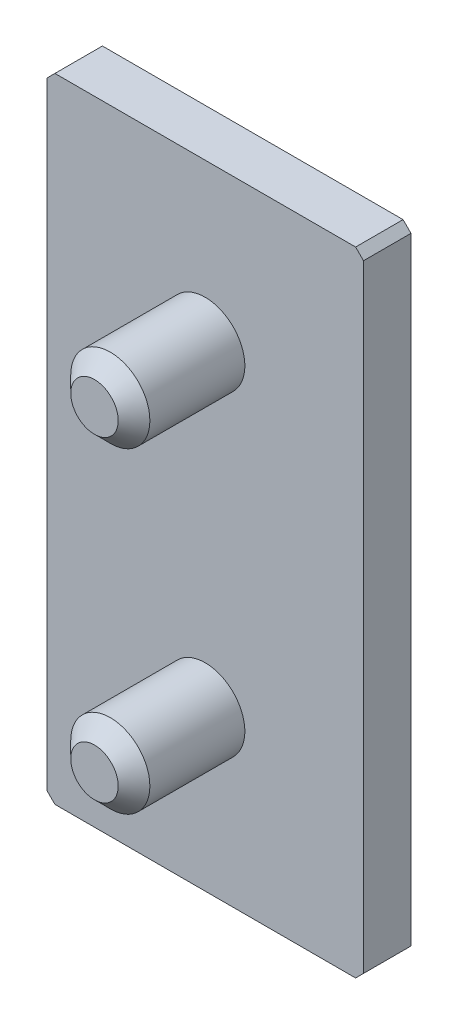
ISO-10303-21;
HEADER;
FILE_DESCRIPTION(('STEP AP214'),'2;1');
FILE_NAME('part.step','',(''),(''),'','','');
FILE_SCHEMA(('AUTOMOTIVE_DESIGN { 1 0 10303 214 1 1 1 1 }'));
ENDSEC;
DATA;
#1=APPLICATION_CONTEXT('core data for automotive mechanical design processes');
#2=APPLICATION_PROTOCOL_DEFINITION('international standard','automotive_design',2000,#1);
#3=PRODUCT_CONTEXT('',#1,'mechanical');
#4=PRODUCT('Part','Part','',(#3));
#5=PRODUCT_RELATED_PRODUCT_CATEGORY('part','',(#4));
#6=PRODUCT_DEFINITION_FORMATION('','',#4);
#7=PRODUCT_DEFINITION_CONTEXT('part definition',#1,'design');
#8=PRODUCT_DEFINITION('design','',#6,#7);
#9=PRODUCT_DEFINITION_SHAPE('','',#8);
#10=(LENGTH_UNIT() NAMED_UNIT(*) SI_UNIT(.MILLI.,.METRE.));
#11=(NAMED_UNIT(*) PLANE_ANGLE_UNIT() SI_UNIT($,.RADIAN.));
#12=(NAMED_UNIT(*) SI_UNIT($,.STERADIAN.) SOLID_ANGLE_UNIT());
#13=UNCERTAINTY_MEASURE_WITH_UNIT(LENGTH_MEASURE(1.E-05),#10,'distance_accuracy_value','');
#14=(GEOMETRIC_REPRESENTATION_CONTEXT(3) GLOBAL_UNCERTAINTY_ASSIGNED_CONTEXT((#13)) GLOBAL_UNIT_ASSIGNED_CONTEXT((#10,
#11,#12)) REPRESENTATION_CONTEXT('',''));
#15=CARTESIAN_POINT('',(0.,0.,0.));
#16=DIRECTION('',(0.,0.,1.));
#17=DIRECTION('',(1.,0.,0.));
#18=AXIS2_PLACEMENT_3D('',#15,#16,#17);
#19=CARTESIAN_POINT('',(0.,0.,3.));
#20=DIRECTION('',(1.,0.,0.));
#21=DIRECTION('',(0.,0.,-1.));
#22=AXIS2_PLACEMENT_3D('',#19,#20,#21);
#23=PLANE('',#22);
#24=DIRECTION('',(0.,-1.,0.));
#25=VECTOR('',#24,1.);
#26=CARTESIAN_POINT('',(0.,0.,0.));
#27=LINE('',#26,#25);
#28=CARTESIAN_POINT('',(0.,39.5,0.));
#29=VERTEX_POINT('',#28);
#30=CARTESIAN_POINT('',(0.,0.5,0.));
#31=VERTEX_POINT('',#30);
#32=EDGE_CURVE('E124',#29,#31,#27,.T.);
#33=ORIENTED_EDGE('',*,*,#32,.T.);
#34=DIRECTION('',(0.,0.,1.));
#35=VECTOR('',#34,1.);
#36=CARTESIAN_POINT('',(0.,0.5,3.));
#37=LINE('',#36,#35);
#38=CARTESIAN_POINT('',(0.,0.5,3.));
#39=VERTEX_POINT('',#38);
#40=EDGE_CURVE('E102',#31,#39,#37,.T.);
#41=ORIENTED_EDGE('',*,*,#40,.T.);
#42=DIRECTION('',(0.,-1.,0.));
#43=VECTOR('',#42,1.);
#44=CARTESIAN_POINT('',(0.,0.,3.));
#45=LINE('',#44,#43);
#46=CARTESIAN_POINT('',(0.,39.5,3.));
#47=VERTEX_POINT('',#46);
#48=EDGE_CURVE('E133',#47,#39,#45,.T.);
#49=ORIENTED_EDGE('',*,*,#48,.F.);
#50=DIRECTION('',(0.,0.,-1.));
#51=VECTOR('',#50,1.);
#52=CARTESIAN_POINT('',(0.,39.5,3.));
#53=LINE('',#52,#51);
#54=EDGE_CURVE('E107',#47,#29,#53,.T.);
#55=ORIENTED_EDGE('',*,*,#54,.T.);
#56=EDGE_LOOP('',(#33,#41,#49,#55));
#57=FACE_BOUND('',#56,.T.);
#58=ADVANCED_FACE('F32',(#57),#23,.F.);
#59=CARTESIAN_POINT('',(0.,0.,3.));
#60=DIRECTION('',(0.,1.,0.));
#61=DIRECTION('',(0.,0.,1.));
#62=AXIS2_PLACEMENT_3D('',#59,#60,#61);
#63=PLANE('',#62);
#64=DIRECTION('',(1.,0.,0.));
#65=VECTOR('',#64,1.);
#66=CARTESIAN_POINT('',(0.,0.,3.));
#67=LINE('',#66,#65);
#68=CARTESIAN_POINT('',(0.5,0.,3.));
#69=VERTEX_POINT('',#68);
#70=CARTESIAN_POINT('',(19.5,1.11022302462516E-13,3.));
#71=VERTEX_POINT('',#70);
#72=EDGE_CURVE('E117',#69,#71,#67,.T.);
#73=ORIENTED_EDGE('',*,*,#72,.F.);
#74=DIRECTION('',(0.,0.,-1.));
#75=VECTOR('',#74,1.);
#76=CARTESIAN_POINT('',(0.5,0.,3.));
#77=LINE('',#76,#75);
#78=CARTESIAN_POINT('',(0.5,0.,0.));
#79=VERTEX_POINT('',#78);
#80=EDGE_CURVE('E101',#69,#79,#77,.T.);
#81=ORIENTED_EDGE('',*,*,#80,.T.);
#82=DIRECTION('',(1.,0.,0.));
#83=VECTOR('',#82,1.);
#84=CARTESIAN_POINT('',(0.,0.,0.));
#85=LINE('',#84,#83);
#86=CARTESIAN_POINT('',(19.5,1.11022302462516E-13,0.));
#87=VERTEX_POINT('',#86);
#88=EDGE_CURVE('E114',#79,#87,#85,.T.);
#89=ORIENTED_EDGE('',*,*,#88,.T.);
#90=DIRECTION('',(0.,0.,1.));
#91=VECTOR('',#90,1.);
#92=CARTESIAN_POINT('',(19.5,1.11022302462516E-13,3.));
#93=LINE('',#92,#91);
#94=EDGE_CURVE('E119',#87,#71,#93,.T.);
#95=ORIENTED_EDGE('',*,*,#94,.T.);
#96=EDGE_LOOP('',(#73,#81,#89,#95));
#97=FACE_BOUND('',#96,.T.);
#98=ADVANCED_FACE('F113',(#97),#63,.F.);
#99=CARTESIAN_POINT('',(20.,1.11022302462516E-13,3.));
#100=DIRECTION('',(-1.,0.,0.));
#101=DIRECTION('',(0.,0.,1.));
#102=AXIS2_PLACEMENT_3D('',#99,#100,#101);
#103=PLANE('',#102);
#104=DIRECTION('',(0.,1.,0.));
#105=VECTOR('',#104,1.);
#106=CARTESIAN_POINT('',(20.,1.11022302462516E-13,3.));
#107=LINE('',#106,#105);
#108=CARTESIAN_POINT('',(20.,0.500000000000111,3.));
#109=VERTEX_POINT('',#108);
#110=CARTESIAN_POINT('',(20.,39.5000000000001,3.));
#111=VERTEX_POINT('',#110);
#112=EDGE_CURVE('E185',#109,#111,#107,.T.);
#113=ORIENTED_EDGE('',*,*,#112,.F.);
#114=DIRECTION('',(0.,0.,-1.));
#115=VECTOR('',#114,1.);
#116=CARTESIAN_POINT('',(20.,0.500000000000111,3.));
#117=LINE('',#116,#115);
#118=CARTESIAN_POINT('',(20.,0.500000000000111,0.));
#119=VERTEX_POINT('',#118);
#120=EDGE_CURVE('E170',#109,#119,#117,.T.);
#121=ORIENTED_EDGE('',*,*,#120,.T.);
#122=DIRECTION('',(0.,1.,0.));
#123=VECTOR('',#122,1.);
#124=CARTESIAN_POINT('',(20.,1.11022302462516E-13,0.));
#125=LINE('',#124,#123);
#126=CARTESIAN_POINT('',(20.,39.5000000000001,0.));
#127=VERTEX_POINT('',#126);
#128=EDGE_CURVE('E123',#119,#127,#125,.T.);
#129=ORIENTED_EDGE('',*,*,#128,.T.);
#130=DIRECTION('',(0.,0.,1.));
#131=VECTOR('',#130,1.);
#132=CARTESIAN_POINT('',(20.,39.5000000000001,3.));
#133=LINE('',#132,#131);
#134=EDGE_CURVE('E168',#127,#111,#133,.T.);
#135=ORIENTED_EDGE('',*,*,#134,.T.);
#136=EDGE_LOOP('',(#113,#121,#129,#135));
#137=FACE_BOUND('',#136,.T.);
#138=ADVANCED_FACE('F198',(#137),#103,.F.);
#139=CARTESIAN_POINT('',(0.,40.,3.));
#140=DIRECTION('',(0.,-1.,0.));
#141=DIRECTION('',(0.,0.,-1.));
#142=AXIS2_PLACEMENT_3D('',#139,#140,#141);
#143=PLANE('',#142);
#144=DIRECTION('',(-1.,0.,0.));
#145=VECTOR('',#144,1.);
#146=CARTESIAN_POINT('',(0.,40.,0.));
#147=LINE('',#146,#145);
#148=CARTESIAN_POINT('',(19.5,40.0000000000001,0.));
#149=VERTEX_POINT('',#148);
#150=CARTESIAN_POINT('',(0.500000000000028,40.,0.));
#151=VERTEX_POINT('',#150);
#152=EDGE_CURVE('E127',#149,#151,#147,.T.);
#153=ORIENTED_EDGE('',*,*,#152,.T.);
#154=DIRECTION('',(0.,0.,1.));
#155=VECTOR('',#154,1.);
#156=CARTESIAN_POINT('',(0.500000000000028,40.,3.));
#157=LINE('',#156,#155);
#158=CARTESIAN_POINT('',(0.500000000000028,40.,3.));
#159=VERTEX_POINT('',#158);
#160=EDGE_CURVE('E11',#151,#159,#157,.T.);
#161=ORIENTED_EDGE('',*,*,#160,.T.);
#162=DIRECTION('',(-1.,0.,0.));
#163=VECTOR('',#162,1.);
#164=CARTESIAN_POINT('',(0.,40.,3.));
#165=LINE('',#164,#163);
#166=CARTESIAN_POINT('',(19.5,40.0000000000001,3.));
#167=VERTEX_POINT('',#166);
#168=EDGE_CURVE('E138',#167,#159,#165,.T.);
#169=ORIENTED_EDGE('',*,*,#168,.F.);
#170=DIRECTION('',(0.,0.,-1.));
#171=VECTOR('',#170,1.);
#172=CARTESIAN_POINT('',(19.5,40.0000000000001,3.));
#173=LINE('',#172,#171);
#174=EDGE_CURVE('E40',#167,#149,#173,.T.);
#175=ORIENTED_EDGE('',*,*,#174,.T.);
#176=EDGE_LOOP('',(#153,#161,#169,#175));
#177=FACE_BOUND('',#176,.T.);
#178=ADVANCED_FACE('F175',(#177),#143,.F.);
#179=CARTESIAN_POINT('',(0.,0.,3.));
#180=DIRECTION('',(0.,0.,-1.));
#181=DIRECTION('',(-1.,0.,0.));
#182=AXIS2_PLACEMENT_3D('',#179,#180,#181);
#183=PLANE('',#182);
#184=CARTESIAN_POINT('',(10.,10.0000000000001,3.));
#185=DIRECTION('',(0.,0.,-1.));
#186=DIRECTION('',(-1.,0.,0.));
#187=AXIS2_PLACEMENT_3D('',#184,#185,#186);
#188=CIRCLE('',#187,2.5);
#189=CARTESIAN_POINT('',(7.50000000000001,10.0000000000001,3.));
#190=VERTEX_POINT('',#189);
#191=EDGE_CURVE('E137',#190,#190,#188,.F.);
#192=ORIENTED_EDGE('',*,*,#191,.F.);
#193=EDGE_LOOP('',(#192));
#194=FACE_BOUND('',#193,.T.);
#195=CARTESIAN_POINT('',(10.,30.0000000000001,3.));
#196=DIRECTION('',(0.,0.,-1.));
#197=DIRECTION('',(-1.,0.,0.));
#198=AXIS2_PLACEMENT_3D('',#195,#196,#197);
#199=CIRCLE('',#198,2.5);
#200=CARTESIAN_POINT('',(7.50000000000003,30.0000000000001,3.));
#201=VERTEX_POINT('',#200);
#202=EDGE_CURVE('E134',#201,#201,#199,.F.);
#203=ORIENTED_EDGE('',*,*,#202,.F.);
#204=EDGE_LOOP('',(#203));
#205=FACE_BOUND('',#204,.T.);
#206=ORIENTED_EDGE('',*,*,#48,.T.);
#207=DIRECTION('',(-0.707106781186543,0.707106781186553,0.));
#208=VECTOR('',#207,1.);
#209=CARTESIAN_POINT('',(0.5,0.,3.));
#210=LINE('',#209,#208);
#211=EDGE_CURVE('E166',#39,#69,#210,.F.);
#212=ORIENTED_EDGE('',*,*,#211,.T.);
#213=ORIENTED_EDGE('',*,*,#72,.T.);
#214=DIRECTION('',(-0.707106781186553,-0.707106781186543,0.));
#215=VECTOR('',#214,1.);
#216=CARTESIAN_POINT('',(20.,0.500000000000111,3.));
#217=LINE('',#216,#215);
#218=EDGE_CURVE('E164',#71,#109,#217,.F.);
#219=ORIENTED_EDGE('',*,*,#218,.T.);
#220=ORIENTED_EDGE('',*,*,#112,.T.);
#221=DIRECTION('',(0.707106781186548,-0.707106781186548,0.));
#222=VECTOR('',#221,1.);
#223=CARTESIAN_POINT('',(19.5,40.0000000000001,3.));
#224=LINE('',#223,#222);
#225=EDGE_CURVE('E52',#111,#167,#224,.F.);
#226=ORIENTED_EDGE('',*,*,#225,.T.);
#227=ORIENTED_EDGE('',*,*,#168,.T.);
#228=DIRECTION('',(0.707106781186548,0.707106781186548,0.));
#229=VECTOR('',#228,1.);
#230=CARTESIAN_POINT('',(0.,39.5,3.));
#231=LINE('',#230,#229);
#232=EDGE_CURVE('E162',#159,#47,#231,.F.);
#233=ORIENTED_EDGE('',*,*,#232,.T.);
#234=EDGE_LOOP('',(#206,#212,#213,#219,#220,#226,#227,#233));
#235=FACE_BOUND('',#234,.T.);
#236=ADVANCED_FACE('F188',(#194,#205,#235),#183,.F.);
#237=CARTESIAN_POINT('',(0.,0.,0.));
#238=DIRECTION('',(0.,0.,-1.));
#239=DIRECTION('',(-1.,0.,0.));
#240=AXIS2_PLACEMENT_3D('',#237,#238,#239);
#241=PLANE('',#240);
#242=ORIENTED_EDGE('',*,*,#88,.F.);
#243=DIRECTION('',(0.707106781186543,-0.707106781186553,0.));
#244=VECTOR('',#243,1.);
#245=CARTESIAN_POINT('',(0.250000000000028,0.249999999999972,0.));
#246=LINE('',#245,#244);
#247=EDGE_CURVE('E97',#79,#31,#246,.F.);
#248=ORIENTED_EDGE('',*,*,#247,.T.);
#249=ORIENTED_EDGE('',*,*,#32,.F.);
#250=DIRECTION('',(-0.707106781186548,-0.707106781186548,0.));
#251=VECTOR('',#250,1.);
#252=CARTESIAN_POINT('',(-19.7500000000001,19.75,0.));
#253=LINE('',#252,#251);
#254=EDGE_CURVE('E155',#29,#151,#253,.F.);
#255=ORIENTED_EDGE('',*,*,#254,.T.);
#256=ORIENTED_EDGE('',*,*,#152,.F.);
#257=DIRECTION('',(-0.707106781186548,0.707106781186548,0.));
#258=VECTOR('',#257,1.);
#259=CARTESIAN_POINT('',(29.75,29.7500000000001,0.));
#260=LINE('',#259,#258);
#261=EDGE_CURVE('E118',#149,#127,#260,.F.);
#262=ORIENTED_EDGE('',*,*,#261,.T.);
#263=ORIENTED_EDGE('',*,*,#128,.F.);
#264=DIRECTION('',(0.707106781186553,0.707106781186543,0.));
#265=VECTOR('',#264,1.);
#266=CARTESIAN_POINT('',(9.74999999999987,-9.74999999999987,0.));
#267=LINE('',#266,#265);
#268=EDGE_CURVE('E108',#119,#87,#267,.F.);
#269=ORIENTED_EDGE('',*,*,#268,.T.);
#270=EDGE_LOOP('',(#242,#248,#249,#255,#256,#262,#263,#269));
#271=FACE_BOUND('',#270,.T.);
#272=ADVANCED_FACE('F121',(#271),#241,.T.);
#273=CARTESIAN_POINT('',(10.,30.0000000000001,10.));
#274=DIRECTION('',(0.,0.,-1.));
#275=DIRECTION('',(-1.,0.,0.));
#276=AXIS2_PLACEMENT_3D('',#273,#274,#275);
#277=CYLINDRICAL_SURFACE('',#276,2.5);
#278=CARTESIAN_POINT('',(10.,30.0000000000001,9.00000000000001));
#279=DIRECTION('',(0.,0.,1.));
#280=DIRECTION('',(1.,0.,0.));
#281=AXIS2_PLACEMENT_3D('',#278,#279,#280);
#282=CIRCLE('',#281,2.5);
#283=CARTESIAN_POINT('',(12.5,30.0000000000001,9.00000000000001));
#284=VERTEX_POINT('',#283);
#285=EDGE_CURVE('E150',#284,#284,#282,.F.);
#286=ORIENTED_EDGE('',*,*,#285,.T.);
#287=EDGE_LOOP('',(#286));
#288=FACE_BOUND('',#287,.T.);
#289=ORIENTED_EDGE('',*,*,#202,.T.);
#290=EDGE_LOOP('',(#289));
#291=FACE_BOUND('',#290,.T.);
#292=ADVANCED_FACE('F196',(#288,#291),#277,.T.);
#293=CARTESIAN_POINT('',(10.,30.0000000000001,10.));
#294=DIRECTION('',(0.,0.,1.));
#295=DIRECTION('',(1.,0.,0.));
#296=AXIS2_PLACEMENT_3D('',#293,#294,#295);
#297=PLANE('',#296);
#298=CARTESIAN_POINT('',(10.,30.0000000000001,10.));
#299=DIRECTION('',(0.,0.,1.));
#300=DIRECTION('',(1.,0.,0.));
#301=AXIS2_PLACEMENT_3D('',#298,#299,#300);
#302=CIRCLE('',#301,1.5);
#303=CARTESIAN_POINT('',(11.5,30.0000000000001,10.));
#304=VERTEX_POINT('',#303);
#305=EDGE_CURVE('E147',#304,#304,#302,.T.);
#306=ORIENTED_EDGE('',*,*,#305,.T.);
#307=EDGE_LOOP('',(#306));
#308=FACE_BOUND('',#307,.T.);
#309=ADVANCED_FACE('F264',(#308),#297,.T.);
#310=CARTESIAN_POINT('',(10.,10.0000000000001,10.));
#311=DIRECTION('',(0.,0.,-1.));
#312=DIRECTION('',(-1.,0.,0.));
#313=AXIS2_PLACEMENT_3D('',#310,#311,#312);
#314=CYLINDRICAL_SURFACE('',#313,2.5);
#315=CARTESIAN_POINT('',(10.,10.0000000000001,9.00000000000001));
#316=DIRECTION('',(0.,0.,1.));
#317=DIRECTION('',(1.,0.,0.));
#318=AXIS2_PLACEMENT_3D('',#315,#316,#317);
#319=CIRCLE('',#318,2.5);
#320=CARTESIAN_POINT('',(12.5,10.0000000000001,9.00000000000001));
#321=VERTEX_POINT('',#320);
#322=EDGE_CURVE('E144',#321,#321,#319,.F.);
#323=ORIENTED_EDGE('',*,*,#322,.T.);
#324=EDGE_LOOP('',(#323));
#325=FACE_BOUND('',#324,.T.);
#326=ORIENTED_EDGE('',*,*,#191,.T.);
#327=EDGE_LOOP('',(#326));
#328=FACE_BOUND('',#327,.T.);
#329=ADVANCED_FACE('F273',(#325,#328),#314,.T.);
#330=CARTESIAN_POINT('',(10.,10.0000000000001,10.));
#331=DIRECTION('',(0.,0.,1.));
#332=DIRECTION('',(1.,0.,0.));
#333=AXIS2_PLACEMENT_3D('',#330,#331,#332);
#334=PLANE('',#333);
#335=CARTESIAN_POINT('',(10.,10.0000000000001,10.));
#336=DIRECTION('',(0.,0.,1.));
#337=DIRECTION('',(1.,0.,0.));
#338=AXIS2_PLACEMENT_3D('',#335,#336,#337);
#339=CIRCLE('',#338,1.5);
#340=CARTESIAN_POINT('',(11.5,10.0000000000001,10.));
#341=VERTEX_POINT('',#340);
#342=EDGE_CURVE('E141',#341,#341,#339,.T.);
#343=ORIENTED_EDGE('',*,*,#342,.T.);
#344=EDGE_LOOP('',(#343));
#345=FACE_BOUND('',#344,.T.);
#346=ADVANCED_FACE('F215',(#345),#334,.T.);
#347=CARTESIAN_POINT('',(10.,10.0000000000001,10.));
#348=DIRECTION('',(0.,0.,-1.));
#349=DIRECTION('',(-1.,0.,0.));
#350=AXIS2_PLACEMENT_3D('',#347,#348,#349);
#351=CONICAL_SURFACE('',#350,1.5,0.785398163397447);
#352=ORIENTED_EDGE('',*,*,#322,.F.);
#353=EDGE_LOOP('',(#352));
#354=FACE_BOUND('',#353,.T.);
#355=ORIENTED_EDGE('',*,*,#342,.F.);
#356=EDGE_LOOP('',(#355));
#357=FACE_BOUND('',#356,.T.);
#358=ADVANCED_FACE('F211',(#354,#357),#351,.T.);
#359=CARTESIAN_POINT('',(10.,30.0000000000001,10.));
#360=DIRECTION('',(0.,0.,-1.));
#361=DIRECTION('',(-1.,0.,0.));
#362=AXIS2_PLACEMENT_3D('',#359,#360,#361);
#363=CONICAL_SURFACE('',#362,1.5,0.785398163397447);
#364=ORIENTED_EDGE('',*,*,#285,.F.);
#365=EDGE_LOOP('',(#364));
#366=FACE_BOUND('',#365,.T.);
#367=ORIENTED_EDGE('',*,*,#305,.F.);
#368=EDGE_LOOP('',(#367));
#369=FACE_BOUND('',#368,.T.);
#370=ADVANCED_FACE('F214',(#366,#369),#363,.T.);
#371=CARTESIAN_POINT('',(0.5,0.,3.));
#372=DIRECTION('',(0.707106781186553,0.707106781186543,0.));
#373=DIRECTION('',(0.,0.,-1.));
#374=AXIS2_PLACEMENT_3D('',#371,#372,#373);
#375=PLANE('',#374);
#376=ORIENTED_EDGE('',*,*,#211,.F.);
#377=ORIENTED_EDGE('',*,*,#40,.F.);
#378=ORIENTED_EDGE('',*,*,#247,.F.);
#379=ORIENTED_EDGE('',*,*,#80,.F.);
#380=EDGE_LOOP('',(#376,#377,#378,#379));
#381=FACE_BOUND('',#380,.T.);
#382=ADVANCED_FACE('F100',(#381),#375,.F.);
#383=CARTESIAN_POINT('',(20.,0.500000000000111,3.));
#384=DIRECTION('',(-0.707106781186543,0.707106781186553,0.));
#385=DIRECTION('',(0.,0.,-1.));
#386=AXIS2_PLACEMENT_3D('',#383,#384,#385);
#387=PLANE('',#386);
#388=ORIENTED_EDGE('',*,*,#218,.F.);
#389=ORIENTED_EDGE('',*,*,#94,.F.);
#390=ORIENTED_EDGE('',*,*,#268,.F.);
#391=ORIENTED_EDGE('',*,*,#120,.F.);
#392=EDGE_LOOP('',(#388,#389,#390,#391));
#393=FACE_BOUND('',#392,.T.);
#394=ADVANCED_FACE('F222',(#393),#387,.F.);
#395=CARTESIAN_POINT('',(0.,39.5,3.));
#396=DIRECTION('',(0.707106781186548,-0.707106781186548,0.));
#397=DIRECTION('',(0.,0.,-1.));
#398=AXIS2_PLACEMENT_3D('',#395,#396,#397);
#399=PLANE('',#398);
#400=ORIENTED_EDGE('',*,*,#232,.F.);
#401=ORIENTED_EDGE('',*,*,#160,.F.);
#402=ORIENTED_EDGE('',*,*,#254,.F.);
#403=ORIENTED_EDGE('',*,*,#54,.F.);
#404=EDGE_LOOP('',(#400,#401,#402,#403));
#405=FACE_BOUND('',#404,.T.);
#406=ADVANCED_FACE('F180',(#405),#399,.F.);
#407=CARTESIAN_POINT('',(19.5,40.0000000000001,3.));
#408=DIRECTION('',(-0.707106781186548,-0.707106781186548,0.));
#409=DIRECTION('',(0.,0.,-1.));
#410=AXIS2_PLACEMENT_3D('',#407,#408,#409);
#411=PLANE('',#410);
#412=ORIENTED_EDGE('',*,*,#225,.F.);
#413=ORIENTED_EDGE('',*,*,#134,.F.);
#414=ORIENTED_EDGE('',*,*,#261,.F.);
#415=ORIENTED_EDGE('',*,*,#174,.F.);
#416=EDGE_LOOP('',(#412,#413,#414,#415));
#417=FACE_BOUND('',#416,.T.);
#418=ADVANCED_FACE('F34',(#417),#411,.F.);
#419=CLOSED_SHELL('',(#58,#98,#138,#178,#236,#272,#292,#309,#329,#346,#358,#370,#382,#394,#406,#418));
#420=MANIFOLD_SOLID_BREP('B2',#419);
#421=ADVANCED_BREP_SHAPE_REPRESENTATION('',(#18,#420),#14);
#422=SHAPE_DEFINITION_REPRESENTATION(#9,#421);
ENDSEC;
END-ISO-10303-21;
